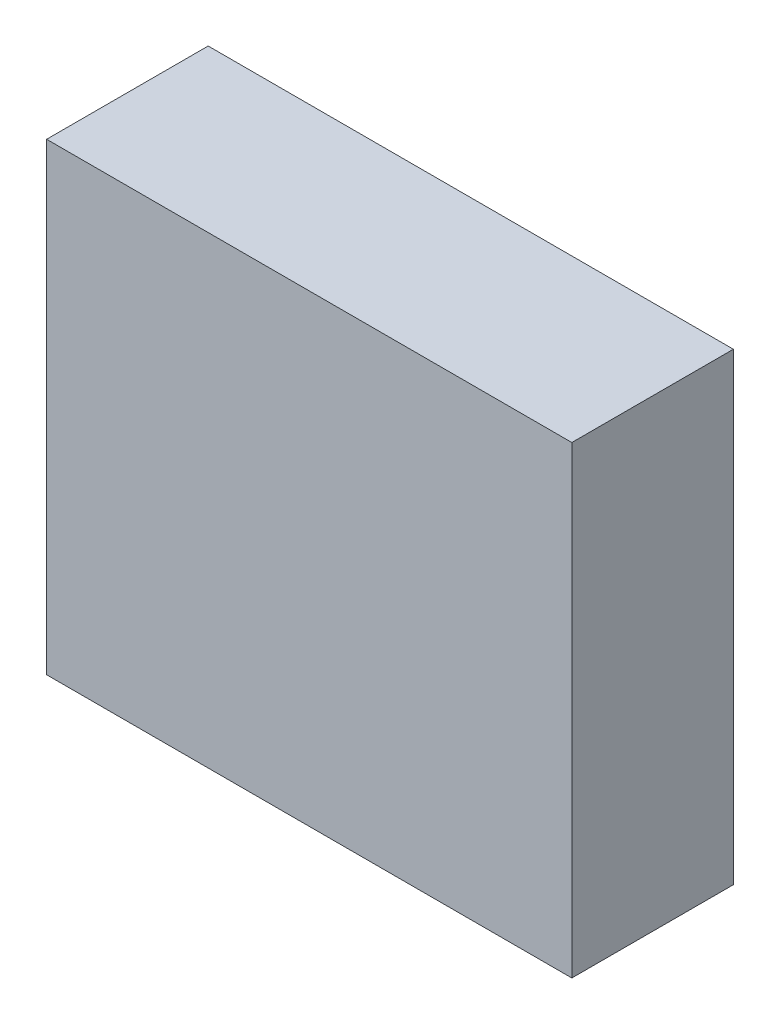
ISO-10303-21;
HEADER;
FILE_DESCRIPTION(('STEP AP214'),'2;1');
FILE_NAME('part.step','',(''),(''),'','','');
FILE_SCHEMA(('AUTOMOTIVE_DESIGN { 1 0 10303 214 1 1 1 1 }'));
ENDSEC;
DATA;
#1=APPLICATION_CONTEXT('core data for automotive mechanical design processes');
#2=APPLICATION_PROTOCOL_DEFINITION('international standard','automotive_design',2000,#1);
#3=PRODUCT_CONTEXT('',#1,'mechanical');
#4=PRODUCT('Part','Part','',(#3));
#5=PRODUCT_RELATED_PRODUCT_CATEGORY('part','',(#4));
#6=PRODUCT_DEFINITION_FORMATION('','',#4);
#7=PRODUCT_DEFINITION_CONTEXT('part definition',#1,'design');
#8=PRODUCT_DEFINITION('design','',#6,#7);
#9=PRODUCT_DEFINITION_SHAPE('','',#8);
#10=(LENGTH_UNIT() NAMED_UNIT(*) SI_UNIT(.MILLI.,.METRE.));
#11=(NAMED_UNIT(*) PLANE_ANGLE_UNIT() SI_UNIT($,.RADIAN.));
#12=(NAMED_UNIT(*) SI_UNIT($,.STERADIAN.) SOLID_ANGLE_UNIT());
#13=UNCERTAINTY_MEASURE_WITH_UNIT(LENGTH_MEASURE(1.E-05),#10,'distance_accuracy_value','');
#14=(GEOMETRIC_REPRESENTATION_CONTEXT(3) GLOBAL_UNCERTAINTY_ASSIGNED_CONTEXT((#13)) GLOBAL_UNIT_ASSIGNED_CONTEXT((#10,
#11,#12)) REPRESENTATION_CONTEXT('',''));
#15=CARTESIAN_POINT('',(0.,0.,0.));
#16=DIRECTION('',(0.,0.,1.));
#17=DIRECTION('',(1.,0.,0.));
#18=AXIS2_PLACEMENT_3D('',#15,#16,#17);
#19=CARTESIAN_POINT('',(-1.6256,-1.550003,1.));
#20=DIRECTION('',(1.,0.,0.));
#21=DIRECTION('',(0.,0.,-1.));
#22=AXIS2_PLACEMENT_3D('',#19,#20,#21);
#23=PLANE('',#22);
#24=DIRECTION('',(0.,-1.,0.));
#25=VECTOR('',#24,1.);
#26=CARTESIAN_POINT('',(-1.6256,-1.550003,0.));
#27=LINE('',#26,#25);
#28=CARTESIAN_POINT('',(-1.6256,1.3208,0.));
#29=VERTEX_POINT('',#28);
#30=CARTESIAN_POINT('',(-1.6256,-1.550003,0.));
#31=VERTEX_POINT('',#30);
#32=EDGE_CURVE('E96',#29,#31,#27,.T.);
#33=ORIENTED_EDGE('',*,*,#32,.T.);
#34=DIRECTION('',(0.,0.,-1.));
#35=VECTOR('',#34,1.);
#36=CARTESIAN_POINT('',(-1.6256,-1.550003,1.));
#37=LINE('',#36,#35);
#38=CARTESIAN_POINT('',(-1.6256,-1.550003,1.));
#39=VERTEX_POINT('',#38);
#40=EDGE_CURVE('E11',#39,#31,#37,.T.);
#41=ORIENTED_EDGE('',*,*,#40,.F.);
#42=DIRECTION('',(0.,-1.,0.));
#43=VECTOR('',#42,1.);
#44=CARTESIAN_POINT('',(-1.6256,-1.550003,1.));
#45=LINE('',#44,#43);
#46=CARTESIAN_POINT('',(-1.6256,1.3208,1.));
#47=VERTEX_POINT('',#46);
#48=EDGE_CURVE('E84',#47,#39,#45,.T.);
#49=ORIENTED_EDGE('',*,*,#48,.F.);
#50=DIRECTION('',(0.,0.,-1.));
#51=VECTOR('',#50,1.);
#52=CARTESIAN_POINT('',(-1.6256,1.3208,1.));
#53=LINE('',#52,#51);
#54=EDGE_CURVE('E92',#47,#29,#53,.T.);
#55=ORIENTED_EDGE('',*,*,#54,.T.);
#56=EDGE_LOOP('',(#33,#41,#49,#55));
#57=FACE_BOUND('',#56,.T.);
#58=ADVANCED_FACE('F33',(#57),#23,.F.);
#59=CARTESIAN_POINT('',(1.6256,-1.550003,1.));
#60=DIRECTION('',(0.,1.,0.));
#61=DIRECTION('',(0.,0.,1.));
#62=AXIS2_PLACEMENT_3D('',#59,#60,#61);
#63=PLANE('',#62);
#64=DIRECTION('',(1.,0.,0.));
#65=VECTOR('',#64,1.);
#66=CARTESIAN_POINT('',(1.6256,-1.550003,0.));
#67=LINE('',#66,#65);
#68=CARTESIAN_POINT('',(1.6256,-1.550003,0.));
#69=VERTEX_POINT('',#68);
#70=EDGE_CURVE('E88',#31,#69,#67,.T.);
#71=ORIENTED_EDGE('',*,*,#70,.T.);
#72=DIRECTION('',(0.,0.,-1.));
#73=VECTOR('',#72,1.);
#74=CARTESIAN_POINT('',(1.6256,-1.550003,1.));
#75=LINE('',#74,#73);
#76=CARTESIAN_POINT('',(1.6256,-1.550003,1.));
#77=VERTEX_POINT('',#76);
#78=EDGE_CURVE('E41',#77,#69,#75,.T.);
#79=ORIENTED_EDGE('',*,*,#78,.F.);
#80=DIRECTION('',(1.,0.,0.));
#81=VECTOR('',#80,1.);
#82=CARTESIAN_POINT('',(1.6256,-1.550003,1.));
#83=LINE('',#82,#81);
#84=EDGE_CURVE('E79',#39,#77,#83,.T.);
#85=ORIENTED_EDGE('',*,*,#84,.F.);
#86=ORIENTED_EDGE('',*,*,#40,.T.);
#87=EDGE_LOOP('',(#71,#79,#85,#86));
#88=FACE_BOUND('',#87,.T.);
#89=ADVANCED_FACE('F87',(#88),#63,.F.);
#90=CARTESIAN_POINT('',(1.6256,1.3208,1.));
#91=DIRECTION('',(-1.,0.,0.));
#92=DIRECTION('',(0.,0.,1.));
#93=AXIS2_PLACEMENT_3D('',#90,#91,#92);
#94=PLANE('',#93);
#95=DIRECTION('',(0.,1.,0.));
#96=VECTOR('',#95,1.);
#97=CARTESIAN_POINT('',(1.6256,1.3208,0.));
#98=LINE('',#97,#96);
#99=CARTESIAN_POINT('',(1.6256,1.3208,0.));
#100=VERTEX_POINT('',#99);
#101=EDGE_CURVE('E66',#69,#100,#98,.T.);
#102=ORIENTED_EDGE('',*,*,#101,.T.);
#103=DIRECTION('',(0.,0.,-1.));
#104=VECTOR('',#103,1.);
#105=CARTESIAN_POINT('',(1.6256,1.3208,1.));
#106=LINE('',#105,#104);
#107=CARTESIAN_POINT('',(1.6256,1.3208,1.));
#108=VERTEX_POINT('',#107);
#109=EDGE_CURVE('E89',#108,#100,#106,.T.);
#110=ORIENTED_EDGE('',*,*,#109,.F.);
#111=DIRECTION('',(0.,1.,0.));
#112=VECTOR('',#111,1.);
#113=CARTESIAN_POINT('',(1.6256,1.3208,1.));
#114=LINE('',#113,#112);
#115=EDGE_CURVE('E82',#77,#108,#114,.T.);
#116=ORIENTED_EDGE('',*,*,#115,.F.);
#117=ORIENTED_EDGE('',*,*,#78,.T.);
#118=EDGE_LOOP('',(#102,#110,#116,#117));
#119=FACE_BOUND('',#118,.T.);
#120=ADVANCED_FACE('F90',(#119),#94,.F.);
#121=CARTESIAN_POINT('',(-1.6256,1.3208,1.));
#122=DIRECTION('',(0.,-1.,0.));
#123=DIRECTION('',(0.,0.,-1.));
#124=AXIS2_PLACEMENT_3D('',#121,#122,#123);
#125=PLANE('',#124);
#126=DIRECTION('',(-1.,0.,0.));
#127=VECTOR('',#126,1.);
#128=CARTESIAN_POINT('',(-1.6256,1.3208,0.));
#129=LINE('',#128,#127);
#130=EDGE_CURVE('E72',#100,#29,#129,.T.);
#131=ORIENTED_EDGE('',*,*,#130,.T.);
#132=ORIENTED_EDGE('',*,*,#54,.F.);
#133=DIRECTION('',(-1.,0.,0.));
#134=VECTOR('',#133,1.);
#135=CARTESIAN_POINT('',(-1.6256,1.3208,1.));
#136=LINE('',#135,#134);
#137=EDGE_CURVE('E49',#108,#47,#136,.T.);
#138=ORIENTED_EDGE('',*,*,#137,.F.);
#139=ORIENTED_EDGE('',*,*,#109,.T.);
#140=EDGE_LOOP('',(#131,#132,#138,#139));
#141=FACE_BOUND('',#140,.T.);
#142=ADVANCED_FACE('F103',(#141),#125,.F.);
#143=CARTESIAN_POINT('',(0.,0.,1.));
#144=DIRECTION('',(0.,0.,-1.));
#145=DIRECTION('',(-1.,0.,0.));
#146=AXIS2_PLACEMENT_3D('',#143,#144,#145);
#147=PLANE('',#146);
#148=ORIENTED_EDGE('',*,*,#48,.T.);
#149=ORIENTED_EDGE('',*,*,#84,.T.);
#150=ORIENTED_EDGE('',*,*,#115,.T.);
#151=ORIENTED_EDGE('',*,*,#137,.T.);
#152=EDGE_LOOP('',(#148,#149,#150,#151));
#153=FACE_BOUND('',#152,.T.);
#154=ADVANCED_FACE('F80',(#153),#147,.F.);
#155=CARTESIAN_POINT('',(0.,0.,0.));
#156=DIRECTION('',(0.,0.,-1.));
#157=DIRECTION('',(-1.,0.,0.));
#158=AXIS2_PLACEMENT_3D('',#155,#156,#157);
#159=PLANE('',#158);
#160=ORIENTED_EDGE('',*,*,#32,.F.);
#161=ORIENTED_EDGE('',*,*,#130,.F.);
#162=ORIENTED_EDGE('',*,*,#101,.F.);
#163=ORIENTED_EDGE('',*,*,#70,.F.);
#164=EDGE_LOOP('',(#160,#161,#162,#163));
#165=FACE_BOUND('',#164,.T.);
#166=ADVANCED_FACE('F106',(#165),#159,.T.);
#167=CLOSED_SHELL('',(#58,#89,#120,#142,#154,#166));
#168=MANIFOLD_SOLID_BREP('B2',#167);
#169=ADVANCED_BREP_SHAPE_REPRESENTATION('',(#18,#168),#14);
#170=SHAPE_DEFINITION_REPRESENTATION(#9,#169);
ENDSEC;
END-ISO-10303-21;
